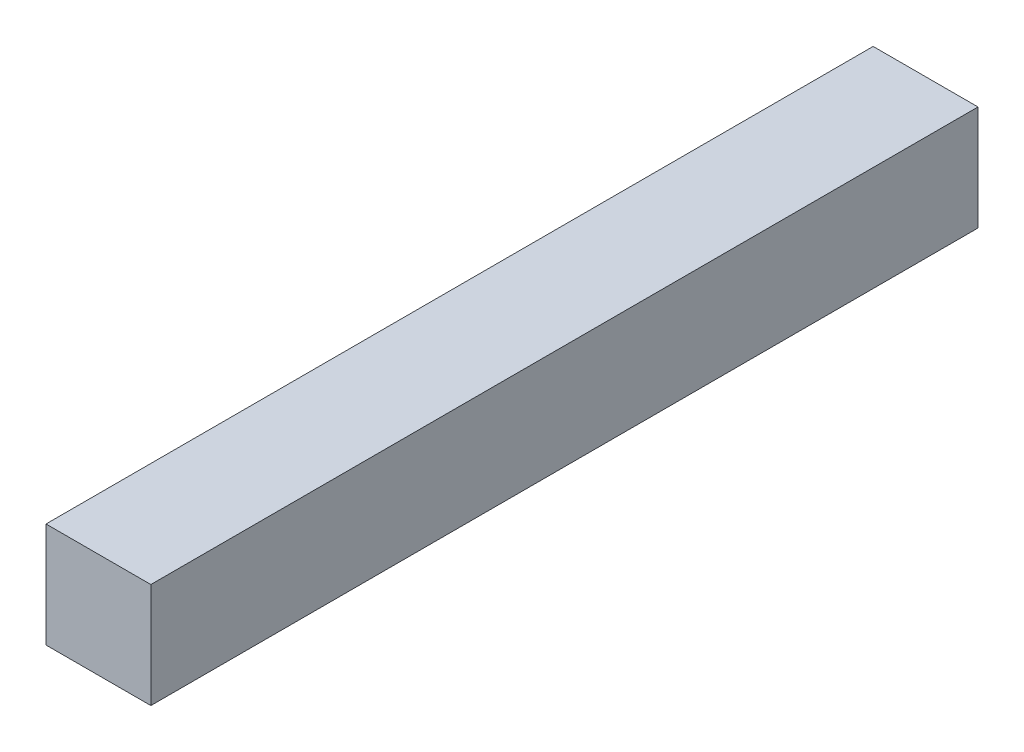
ISO-10303-21;
HEADER;
FILE_DESCRIPTION(('STEP AP214'),'2;1');
FILE_NAME('part.step','',(''),(''),'','','');
FILE_SCHEMA(('AUTOMOTIVE_DESIGN { 1 0 10303 214 1 1 1 1 }'));
ENDSEC;
DATA;
#1=APPLICATION_CONTEXT('core data for automotive mechanical design processes');
#2=APPLICATION_PROTOCOL_DEFINITION('international standard','automotive_design',2000,#1);
#3=PRODUCT_CONTEXT('',#1,'mechanical');
#4=PRODUCT('Part','Part','',(#3));
#5=PRODUCT_RELATED_PRODUCT_CATEGORY('part','',(#4));
#6=PRODUCT_DEFINITION_FORMATION('','',#4);
#7=PRODUCT_DEFINITION_CONTEXT('part definition',#1,'design');
#8=PRODUCT_DEFINITION('design','',#6,#7);
#9=PRODUCT_DEFINITION_SHAPE('','',#8);
#10=(LENGTH_UNIT() NAMED_UNIT(*) SI_UNIT(.MILLI.,.METRE.));
#11=(NAMED_UNIT(*) PLANE_ANGLE_UNIT() SI_UNIT($,.RADIAN.));
#12=(NAMED_UNIT(*) SI_UNIT($,.STERADIAN.) SOLID_ANGLE_UNIT());
#13=UNCERTAINTY_MEASURE_WITH_UNIT(LENGTH_MEASURE(1.E-05),#10,'distance_accuracy_value','');
#14=(GEOMETRIC_REPRESENTATION_CONTEXT(3) GLOBAL_UNCERTAINTY_ASSIGNED_CONTEXT((#13)) GLOBAL_UNIT_ASSIGNED_CONTEXT((#10,
#11,#12)) REPRESENTATION_CONTEXT('',''));
#15=CARTESIAN_POINT('',(0.,0.,0.));
#16=DIRECTION('',(0.,0.,1.));
#17=DIRECTION('',(1.,0.,0.));
#18=AXIS2_PLACEMENT_3D('',#15,#16,#17);
#19=CARTESIAN_POINT('',(-321.,9.,167.455844122716));
#20=DIRECTION('',(-1.,0.,0.));
#21=DIRECTION('',(0.,0.,1.));
#22=AXIS2_PLACEMENT_3D('',#19,#20,#21);
#23=PLANE('',#22);
#24=DIRECTION('',(0.,1.,0.));
#25=VECTOR('',#24,1.);
#26=CARTESIAN_POINT('',(-321.,8.99999999999998,142.));
#27=LINE('',#26,#25);
#28=CARTESIAN_POINT('',(-321.,-8.99999999999995,142.));
#29=VERTEX_POINT('',#28);
#30=CARTESIAN_POINT('',(-321.,9.00000000000005,142.));
#31=VERTEX_POINT('',#30);
#32=EDGE_CURVE('E105',#29,#31,#27,.T.);
#33=ORIENTED_EDGE('',*,*,#32,.F.);
#34=DIRECTION('',(0.,0.,-1.));
#35=VECTOR('',#34,1.);
#36=CARTESIAN_POINT('',(-321.,-9.,167.455844122716));
#37=LINE('',#36,#35);
#38=CARTESIAN_POINT('',(-321.,-9.,0.));
#39=VERTEX_POINT('',#38);
#40=EDGE_CURVE('E96',#29,#39,#37,.T.);
#41=ORIENTED_EDGE('',*,*,#40,.T.);
#42=DIRECTION('',(0.,1.,0.));
#43=VECTOR('',#42,1.);
#44=CARTESIAN_POINT('',(-321.,9.,0.));
#45=LINE('',#44,#43);
#46=CARTESIAN_POINT('',(-321.,9.,0.));
#47=VERTEX_POINT('',#46);
#48=EDGE_CURVE('E87',#39,#47,#45,.T.);
#49=ORIENTED_EDGE('',*,*,#48,.T.);
#50=DIRECTION('',(0.,0.,-1.));
#51=VECTOR('',#50,1.);
#52=CARTESIAN_POINT('',(-321.,9.,167.455844122716));
#53=LINE('',#52,#51);
#54=EDGE_CURVE('E78',#31,#47,#53,.T.);
#55=ORIENTED_EDGE('',*,*,#54,.F.);
#56=EDGE_LOOP('',(#33,#41,#49,#55));
#57=FACE_BOUND('',#56,.T.);
#58=ADVANCED_FACE('F37',(#57),#23,.F.);
#59=CARTESIAN_POINT('',(-339.,9.,167.455844122716));
#60=DIRECTION('',(0.,-1.,0.));
#61=DIRECTION('',(0.,0.,-1.));
#62=AXIS2_PLACEMENT_3D('',#59,#60,#61);
#63=PLANE('',#62);
#64=DIRECTION('',(-1.,0.,0.));
#65=VECTOR('',#64,1.);
#66=CARTESIAN_POINT('',(-339.,9.,142.));
#67=LINE('',#66,#65);
#68=CARTESIAN_POINT('',(-339.,9.00000000000005,142.));
#69=VERTEX_POINT('',#68);
#70=EDGE_CURVE('E84',#31,#69,#67,.T.);
#71=ORIENTED_EDGE('',*,*,#70,.F.);
#72=ORIENTED_EDGE('',*,*,#54,.T.);
#73=DIRECTION('',(-1.,0.,0.));
#74=VECTOR('',#73,1.);
#75=CARTESIAN_POINT('',(-339.,9.,0.));
#76=LINE('',#75,#74);
#77=CARTESIAN_POINT('',(-339.,9.,0.));
#78=VERTEX_POINT('',#77);
#79=EDGE_CURVE('E81',#47,#78,#76,.T.);
#80=ORIENTED_EDGE('',*,*,#79,.T.);
#81=DIRECTION('',(0.,0.,-1.));
#82=VECTOR('',#81,1.);
#83=CARTESIAN_POINT('',(-339.,9.,167.455844122716));
#84=LINE('',#83,#82);
#85=EDGE_CURVE('E72',#69,#78,#84,.T.);
#86=ORIENTED_EDGE('',*,*,#85,.F.);
#87=EDGE_LOOP('',(#71,#72,#80,#86));
#88=FACE_BOUND('',#87,.T.);
#89=ADVANCED_FACE('F80',(#88),#63,.F.);
#90=CARTESIAN_POINT('',(-339.,9.,167.455844122716));
#91=DIRECTION('',(1.,0.,0.));
#92=DIRECTION('',(0.,0.,-1.));
#93=AXIS2_PLACEMENT_3D('',#90,#91,#92);
#94=PLANE('',#93);
#95=DIRECTION('',(0.,-1.,0.));
#96=VECTOR('',#95,1.);
#97=CARTESIAN_POINT('',(-339.,8.99999999999998,142.));
#98=LINE('',#97,#96);
#99=CARTESIAN_POINT('',(-339.,-9.,142.));
#100=VERTEX_POINT('',#99);
#101=EDGE_CURVE('E41',#69,#100,#98,.T.);
#102=ORIENTED_EDGE('',*,*,#101,.F.);
#103=ORIENTED_EDGE('',*,*,#85,.T.);
#104=DIRECTION('',(0.,-1.,0.));
#105=VECTOR('',#104,1.);
#106=CARTESIAN_POINT('',(-339.,9.,0.));
#107=LINE('',#106,#105);
#108=CARTESIAN_POINT('',(-339.,-9.,0.));
#109=VERTEX_POINT('',#108);
#110=EDGE_CURVE('E93',#78,#109,#107,.T.);
#111=ORIENTED_EDGE('',*,*,#110,.T.);
#112=DIRECTION('',(0.,0.,-1.));
#113=VECTOR('',#112,1.);
#114=CARTESIAN_POINT('',(-339.,-9.,167.455844122716));
#115=LINE('',#114,#113);
#116=EDGE_CURVE('E103',#100,#109,#115,.T.);
#117=ORIENTED_EDGE('',*,*,#116,.F.);
#118=EDGE_LOOP('',(#102,#103,#111,#117));
#119=FACE_BOUND('',#118,.T.);
#120=ADVANCED_FACE('F110',(#119),#94,.F.);
#121=CARTESIAN_POINT('',(-339.,-9.,167.455844122716));
#122=DIRECTION('',(0.,1.,0.));
#123=DIRECTION('',(0.,0.,1.));
#124=AXIS2_PLACEMENT_3D('',#121,#122,#123);
#125=PLANE('',#124);
#126=DIRECTION('',(1.,0.,0.));
#127=VECTOR('',#126,1.);
#128=CARTESIAN_POINT('',(-339.,-9.,142.));
#129=LINE('',#128,#127);
#130=EDGE_CURVE('E11',#100,#29,#129,.T.);
#131=ORIENTED_EDGE('',*,*,#130,.F.);
#132=ORIENTED_EDGE('',*,*,#116,.T.);
#133=DIRECTION('',(1.,0.,0.));
#134=VECTOR('',#133,1.);
#135=CARTESIAN_POINT('',(-339.,-9.,0.));
#136=LINE('',#135,#134);
#137=EDGE_CURVE('E104',#109,#39,#136,.T.);
#138=ORIENTED_EDGE('',*,*,#137,.T.);
#139=ORIENTED_EDGE('',*,*,#40,.F.);
#140=EDGE_LOOP('',(#131,#132,#138,#139));
#141=FACE_BOUND('',#140,.T.);
#142=ADVANCED_FACE('F111',(#141),#125,.F.);
#143=CARTESIAN_POINT('',(0.,0.,0.));
#144=DIRECTION('',(0.,0.,1.));
#145=DIRECTION('',(1.,0.,0.));
#146=AXIS2_PLACEMENT_3D('',#143,#144,#145);
#147=PLANE('',#146);
#148=ORIENTED_EDGE('',*,*,#48,.F.);
#149=ORIENTED_EDGE('',*,*,#137,.F.);
#150=ORIENTED_EDGE('',*,*,#110,.F.);
#151=ORIENTED_EDGE('',*,*,#79,.F.);
#152=EDGE_LOOP('',(#148,#149,#150,#151));
#153=FACE_BOUND('',#152,.T.);
#154=ADVANCED_FACE('F91',(#153),#147,.F.);
#155=CARTESIAN_POINT('',(-500.,-8.99999999999995,142.));
#156=DIRECTION('',(0.,0.,1.));
#157=DIRECTION('',(0.,1.,0.));
#158=AXIS2_PLACEMENT_3D('',#155,#156,#157);
#159=PLANE('',#158);
#160=ORIENTED_EDGE('',*,*,#32,.T.);
#161=ORIENTED_EDGE('',*,*,#70,.T.);
#162=ORIENTED_EDGE('',*,*,#101,.T.);
#163=ORIENTED_EDGE('',*,*,#130,.T.);
#164=EDGE_LOOP('',(#160,#161,#162,#163));
#165=FACE_BOUND('',#164,.T.);
#166=ADVANCED_FACE('F39',(#165),#159,.T.);
#167=CLOSED_SHELL('',(#58,#89,#120,#142,#154,#166));
#168=MANIFOLD_SOLID_BREP('B2',#167);
#169=ADVANCED_BREP_SHAPE_REPRESENTATION('',(#18,#168),#14);
#170=SHAPE_DEFINITION_REPRESENTATION(#9,#169);
ENDSEC;
END-ISO-10303-21;
